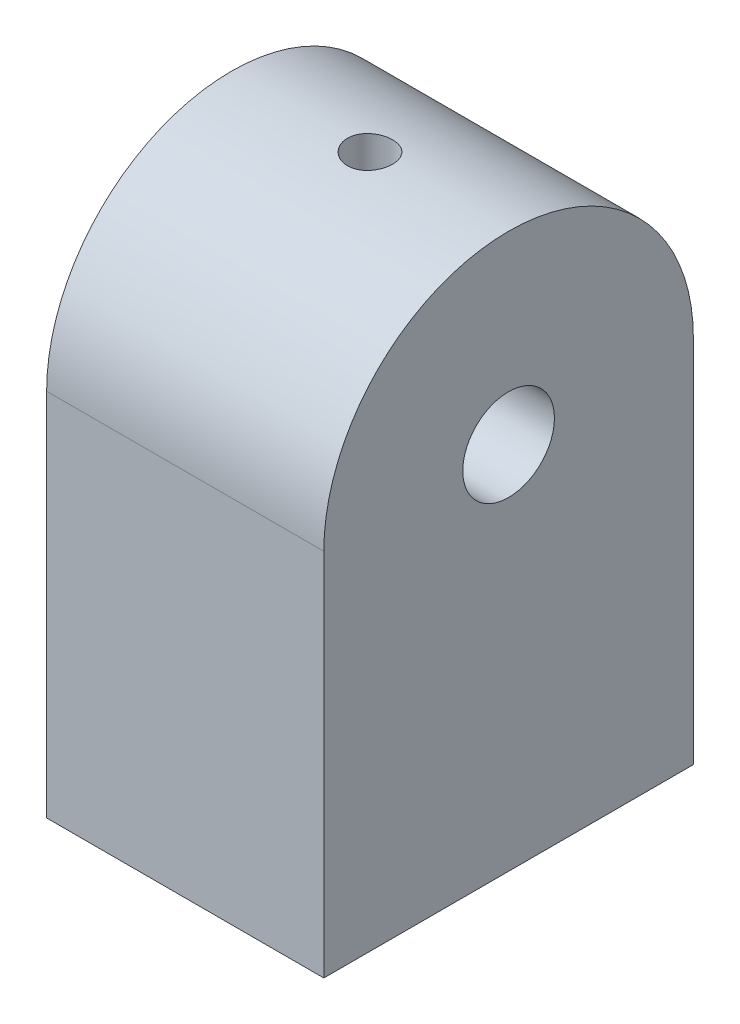
ISO-10303-21;
HEADER;
FILE_DESCRIPTION(('STEP AP214'),'2;1');
FILE_NAME('part.step','',(''),(''),'','','');
FILE_SCHEMA(('AUTOMOTIVE_DESIGN { 1 0 10303 214 1 1 1 1 }'));
ENDSEC;
DATA;
#1=APPLICATION_CONTEXT('core data for automotive mechanical design processes');
#2=APPLICATION_PROTOCOL_DEFINITION('international standard','automotive_design',2000,#1);
#3=PRODUCT_CONTEXT('',#1,'mechanical');
#4=PRODUCT('Part','Part','',(#3));
#5=PRODUCT_RELATED_PRODUCT_CATEGORY('part','',(#4));
#6=PRODUCT_DEFINITION_FORMATION('','',#4);
#7=PRODUCT_DEFINITION_CONTEXT('part definition',#1,'design');
#8=PRODUCT_DEFINITION('design','',#6,#7);
#9=PRODUCT_DEFINITION_SHAPE('','',#8);
#10=(LENGTH_UNIT() NAMED_UNIT(*) SI_UNIT(.MILLI.,.METRE.));
#11=(NAMED_UNIT(*) PLANE_ANGLE_UNIT() SI_UNIT($,.RADIAN.));
#12=(NAMED_UNIT(*) SI_UNIT($,.STERADIAN.) SOLID_ANGLE_UNIT());
#13=UNCERTAINTY_MEASURE_WITH_UNIT(LENGTH_MEASURE(1.E-05),#10,'distance_accuracy_value','');
#14=(GEOMETRIC_REPRESENTATION_CONTEXT(3) GLOBAL_UNCERTAINTY_ASSIGNED_CONTEXT((#13)) GLOBAL_UNIT_ASSIGNED_CONTEXT((#10,
#11,#12)) REPRESENTATION_CONTEXT('',''));
#15=CARTESIAN_POINT('',(0.,0.,0.));
#16=DIRECTION('',(0.,0.,1.));
#17=DIRECTION('',(1.,0.,0.));
#18=AXIS2_PLACEMENT_3D('',#15,#16,#17);
#19=CARTESIAN_POINT('',(19.05,0.,0.));
#20=DIRECTION('',(-1.,0.,0.));
#21=DIRECTION('',(0.,0.,1.));
#22=AXIS2_PLACEMENT_3D('',#19,#20,#21);
#23=CYLINDRICAL_SURFACE('',#22,12.7);
#24=CARTESIAN_POINT('',(9.525,12.6050585083926,1.55));
#25=CARTESIAN_POINT('',(9.43828439633688,12.6050597281026,1.54999630343117));
#26=CARTESIAN_POINT('',(9.35151418756669,12.6059629989048,1.54269842256029));
#27=CARTESIAN_POINT('',(9.18038741890009,12.6094772308036,1.51370045177698));
#28=CARTESIAN_POINT('',(9.09603349657854,12.6120899889592,1.49198520558837));
#29=CARTESIAN_POINT('',(8.93224178265716,12.6187229469086,1.43480118939925));
#30=CARTESIAN_POINT('',(8.85280074184576,12.6227422045205,1.39934162469759));
#31=CARTESIAN_POINT('',(8.70101205203439,12.6317341543352,1.3156949945592));
#32=CARTESIAN_POINT('',(8.62866316812048,12.6367066801039,1.26751015031463));
#33=CARTESIAN_POINT('',(8.4927109154581,12.6470746380593,1.15950493833858));
#34=CARTESIAN_POINT('',(8.42915090097718,12.6524719740522,1.09963017496472));
#35=CARTESIAN_POINT('',(8.31295497515077,12.6630642693682,0.97006176178273));
#36=CARTESIAN_POINT('',(8.26031960146911,12.6682592187203,0.90036762899075));
#37=CARTESIAN_POINT('',(8.16731219391353,12.6778808213328,0.75286710056468));
#38=CARTESIAN_POINT('',(8.12697930115505,12.6823050035928,0.67503584934896));
#39=CARTESIAN_POINT('',(8.05997241852068,12.6898656851265,0.513641796012167));
#40=CARTESIAN_POINT('',(8.03329794435266,12.6930022300556,0.430079197228975));
#41=CARTESIAN_POINT('',(7.99449436109489,12.6976208299471,0.260037345030383));
#42=CARTESIAN_POINT('',(7.9822932595898,12.699111071267,0.173574746204137));
#43=CARTESIAN_POINT('',(7.97255969723229,12.700297095441,-0.000182759228533415));
#44=CARTESIAN_POINT('',(7.97502668474856,12.6999929457777,-0.0874776344117916));
#45=CARTESIAN_POINT('',(7.9945014802059,12.6976310906728,-0.259932039986198));
#46=CARTESIAN_POINT('',(8.01143186396214,12.6955827224182,-0.345100459525125));
#47=CARTESIAN_POINT('',(8.05923188394579,12.6899731017917,-0.511378084856406));
#48=CARTESIAN_POINT('',(8.0901017746593,12.6864118217995,-0.592487216510488));
#49=CARTESIAN_POINT('',(8.16498719056126,12.6781604733776,-0.748584130758067));
#50=CARTESIAN_POINT('',(8.20903631918138,12.6734675255132,-0.823555634165232));
#51=CARTESIAN_POINT('',(8.30900537928631,12.6634780844907,-0.965071537540127));
#52=CARTESIAN_POINT('',(8.36492582985299,12.6581815649458,-1.03161556880753));
#53=CARTESIAN_POINT('',(8.48748403198491,12.6475372032355,-1.15484227392803));
#54=CARTESIAN_POINT('',(8.55418924368757,12.6421892515337,-1.21145786530756));
#55=CARTESIAN_POINT('',(8.69619143432719,12.6320788824911,-1.31269947842873));
#56=CARTESIAN_POINT('',(8.77148843797889,12.6273164668346,-1.35732546568039));
#57=CARTESIAN_POINT('',(8.9285955158682,12.6189163875327,-1.43332439934156));
#58=CARTESIAN_POINT('',(9.01040813768252,12.6152791665749,-1.46469213129991));
#59=CARTESIAN_POINT('',(9.17819376039931,12.6095500043591,-1.51322548174541));
#60=CARTESIAN_POINT('',(9.26416657027932,12.6074579922216,-1.5303917516643));
#61=CARTESIAN_POINT('',(9.43724010973637,12.6050689928309,-1.54994638075465));
#62=CARTESIAN_POINT('',(9.52433002898915,12.6047605474786,-1.55242907342255));
#63=CARTESIAN_POINT('',(9.69768456566861,12.6059433109282,-1.54279482465573));
#64=CARTESIAN_POINT('',(9.78394919980925,12.6074344832057,-1.53067817952529));
#65=CARTESIAN_POINT('',(9.95292273623674,12.6120380135831,-1.49226856448511));
#66=CARTESIAN_POINT('',(10.0356421441969,12.6151451628191,-1.46602113358276));
#67=CARTESIAN_POINT('',(10.1955055166998,12.6226263276656,-1.40014184210469));
#68=CARTESIAN_POINT('',(10.2726492939267,12.6270003858138,-1.36050953211152));
#69=CARTESIAN_POINT('',(10.4195987837699,12.6365500086172,-1.26875299589879));
#70=CARTESIAN_POINT('',(10.4893655574672,12.641729501337,-1.21656682385357));
#71=CARTESIAN_POINT('',(10.6191836289568,12.6522939974483,-1.10127166213115));
#72=CARTESIAN_POINT('',(10.6792345666537,12.6576790084478,-1.03816226778869));
#73=CARTESIAN_POINT('',(10.7882469338406,12.6680829075909,-0.902400385373916));
#74=CARTESIAN_POINT('',(10.8371464342391,12.6730996509913,-0.829697982482007));
#75=CARTESIAN_POINT('',(10.9220396458618,12.6821698056599,-0.677057068415659));
#76=CARTESIAN_POINT('',(10.9580336067785,12.6862232355655,-0.597118697277993));
#77=CARTESIAN_POINT('',(11.0159913907447,12.6929005122847,-0.432482131296456));
#78=CARTESIAN_POINT('',(11.0379912124686,12.6955280245634,-0.347796764034483));
#79=CARTESIAN_POINT('',(11.0674533832219,12.6990726156914,-0.175900021069135));
#80=CARTESIAN_POINT('',(11.0749163556655,12.6999897678898,-0.088688753851987));
#81=CARTESIAN_POINT('',(11.0750817083937,12.7000099956811,0.0851790339896079));
#82=CARTESIAN_POINT('',(11.0678796628476,12.6991248173403,0.171835477936462));
#83=CARTESIAN_POINT('',(11.0391215811767,12.6956631637845,0.342696731001358));
#84=CARTESIAN_POINT('',(11.0175655518492,12.6930866893704,0.426901541280365));
#85=CARTESIAN_POINT('',(10.9607409710377,12.6865307050751,0.590458232087275));
#86=CARTESIAN_POINT('',(10.9254767733179,12.682551640699,0.669811644185672));
#87=CARTESIAN_POINT('',(10.8422467806371,12.6736314576911,0.821489359733055));
#88=CARTESIAN_POINT('',(10.7942808633243,12.6686903297921,0.893813595462947));
#89=CARTESIAN_POINT('',(10.6866546594971,12.6583593898973,1.02986849301666));
#90=CARTESIAN_POINT('',(10.6269232249276,12.6529669690131,1.09354267811636));
#91=CARTESIAN_POINT('',(10.4976087522968,12.6423623020128,1.21000178107121));
#92=CARTESIAN_POINT('',(10.4280233807051,12.6371500989393,1.26278411230864));
#93=CARTESIAN_POINT('',(10.2806835175583,12.6274755372174,1.35612626176032));
#94=CARTESIAN_POINT('',(10.2028998713366,12.6230160121502,1.39664032924219));
#95=CARTESIAN_POINT('',(10.04162297796,12.6153849841421,1.46397414833981));
#96=CARTESIAN_POINT('',(9.95813608443011,12.6122120743494,1.49080886596847));
#97=CARTESIAN_POINT('',(9.81600966170555,12.6082878165417,1.52356290595442));
#98=CARTESIAN_POINT('',(9.7582683243704,12.6070828171679,1.53346265259569));
#99=CARTESIAN_POINT('',(9.64202627879842,12.6054677543156,1.54668242369402));
#100=CARTESIAN_POINT('',(9.58352557595597,12.6050576851932,1.5500024948661));
#101=CARTESIAN_POINT('',(9.525,12.6050585083926,1.55));
#102=B_SPLINE_CURVE_WITH_KNOTS('',3,(#24,#25,#26,#27,#28,#29,#30,#31,#32,#33,#34,#35,#36,#37,
#38,#39,#40,#41,#42,#43,#44,#45,#46,#47,#48,#49,#50,#51,#52,#53,#54,#55,#56,#57,#58,#59,#60,#61,
#62,#63,#64,#65,#66,#67,#68,#69,#70,#71,#72,#73,#74,#75,#76,#77,#78,#79,#80,#81,#82,#83,#84,#85,
#86,#87,#88,#89,#90,#91,#92,#93,#94,#95,#96,#97,#98,#99,#100,#101),.UNSPECIFIED.,.T.,.F.,(4,2,2,
2,2,2,2,2,2,2,2,2,2,2,2,2,2,2,2,2,2,2,2,2,2,2,2,2,2,2,2,2,2,2,2,2,2,2,4),(0.,0.259933017808429,
0.520139724162648,0.78017245658592,1.04015983037067,1.3013871238649,1.56262727079574,
1.82469010267902,2.08674364184991,2.3474881530168,2.60822285827605,2.86757050504712,
3.12692288678055,3.38694226432263,3.64697301373697,3.90869813624248,4.1704240116333,
4.43225272783604,4.69406943309285,4.95420227441904,5.21432983624715,5.47362406474086,
5.73292700029375,5.9935366787987,6.25415601400205,6.5161892351368,6.77821738625973,
7.03956873805277,7.3009088815241,7.56055128304974,7.82019356162039,8.07975344414267,
8.3393158270174,8.60049888201402,8.86174389204684,9.12395146624809,9.38587155092573,
9.56130523234605,9.73673766820053),.UNSPECIFIED.);
#103=CARTESIAN_POINT('',(9.525,12.6050585083926,1.55));
#104=VERTEX_POINT('',#103);
#105=EDGE_CURVE('E114',#104,#104,#102,.T.);
#106=ORIENTED_EDGE('',*,*,#105,.T.);
#107=EDGE_LOOP('',(#106));
#108=FACE_BOUND('',#107,.T.);
#109=DIRECTION('',(1.,0.,0.));
#110=VECTOR('',#109,1.);
#111=CARTESIAN_POINT('',(-35.9210244842766,0.,-12.7));
#112=LINE('',#111,#110);
#113=CARTESIAN_POINT('',(0.,0.,-12.7));
#114=VERTEX_POINT('',#113);
#115=CARTESIAN_POINT('',(19.05,0.,-12.7));
#116=VERTEX_POINT('',#115);
#117=EDGE_CURVE('E99',#114,#116,#112,.T.);
#118=ORIENTED_EDGE('',*,*,#117,.F.);
#119=CARTESIAN_POINT('',(0.,0.,0.));
#120=DIRECTION('',(1.,0.,0.));
#121=DIRECTION('',(0.,0.,-1.));
#122=AXIS2_PLACEMENT_3D('',#119,#120,#121);
#123=CIRCLE('',#122,12.7);
#124=CARTESIAN_POINT('',(0.,0.,12.7));
#125=VERTEX_POINT('',#124);
#126=EDGE_CURVE('E51',#114,#125,#123,.T.);
#127=ORIENTED_EDGE('',*,*,#126,.T.);
#128=DIRECTION('',(1.,0.,0.));
#129=VECTOR('',#128,1.);
#130=CARTESIAN_POINT('',(-35.9210244842766,0.,12.7));
#131=LINE('',#130,#129);
#132=CARTESIAN_POINT('',(19.05,0.,12.7));
#133=VERTEX_POINT('',#132);
#134=EDGE_CURVE('E126',#125,#133,#131,.T.);
#135=ORIENTED_EDGE('',*,*,#134,.T.);
#136=CARTESIAN_POINT('',(19.05,0.,0.));
#137=DIRECTION('',(1.,0.,0.));
#138=DIRECTION('',(0.,0.,-1.));
#139=AXIS2_PLACEMENT_3D('',#136,#137,#138);
#140=CIRCLE('',#139,12.7);
#141=EDGE_CURVE('E11',#116,#133,#140,.T.);
#142=ORIENTED_EDGE('',*,*,#141,.F.);
#143=EDGE_LOOP('',(#118,#127,#135,#142));
#144=FACE_BOUND('',#143,.T.);
#145=ADVANCED_FACE('F50',(#108,#144),#23,.T.);
#146=CARTESIAN_POINT('',(19.05,0.,0.));
#147=DIRECTION('',(1.,0.,0.));
#148=DIRECTION('',(0.,0.,-1.));
#149=AXIS2_PLACEMENT_3D('',#146,#147,#148);
#150=PLANE('',#149);
#151=ORIENTED_EDGE('',*,*,#141,.T.);
#152=DIRECTION('',(0.,-1.,0.));
#153=VECTOR('',#152,1.);
#154=CARTESIAN_POINT('',(19.05,0.,12.7));
#155=LINE('',#154,#153);
#156=CARTESIAN_POINT('',(19.05,-25.4,12.7));
#157=VERTEX_POINT('',#156);
#158=EDGE_CURVE('E64',#133,#157,#155,.T.);
#159=ORIENTED_EDGE('',*,*,#158,.T.);
#160=DIRECTION('',(0.,0.,1.));
#161=VECTOR('',#160,1.);
#162=CARTESIAN_POINT('',(19.05,-25.4,0.));
#163=LINE('',#162,#161);
#164=CARTESIAN_POINT('',(19.05,-25.4,-12.7));
#165=VERTEX_POINT('',#164);
#166=EDGE_CURVE('E96',#165,#157,#163,.T.);
#167=ORIENTED_EDGE('',*,*,#166,.F.);
#168=DIRECTION('',(0.,-1.,0.));
#169=VECTOR('',#168,1.);
#170=CARTESIAN_POINT('',(19.05,0.,-12.7));
#171=LINE('',#170,#169);
#172=EDGE_CURVE('E103',#116,#165,#171,.T.);
#173=ORIENTED_EDGE('',*,*,#172,.F.);
#174=EDGE_LOOP('',(#151,#159,#167,#173));
#175=FACE_BOUND('',#174,.T.);
#176=CARTESIAN_POINT('',(19.05,0.,0.));
#177=DIRECTION('',(1.,0.,0.));
#178=DIRECTION('',(0.,0.,-1.));
#179=AXIS2_PLACEMENT_3D('',#176,#177,#178);
#180=CIRCLE('',#179,3.15);
#181=CARTESIAN_POINT('',(19.05,0.,-3.15));
#182=VERTEX_POINT('',#181);
#183=EDGE_CURVE('E133',#182,#182,#180,.T.);
#184=ORIENTED_EDGE('',*,*,#183,.F.);
#185=EDGE_LOOP('',(#184));
#186=FACE_BOUND('',#185,.T.);
#187=ADVANCED_FACE('F109',(#175,#186),#150,.T.);
#188=CARTESIAN_POINT('',(0.,0.,0.));
#189=DIRECTION('',(1.,0.,0.));
#190=DIRECTION('',(0.,0.,-1.));
#191=AXIS2_PLACEMENT_3D('',#188,#189,#190);
#192=PLANE('',#191);
#193=ORIENTED_EDGE('',*,*,#126,.F.);
#194=DIRECTION('',(0.,1.,0.));
#195=VECTOR('',#194,1.);
#196=CARTESIAN_POINT('',(0.,0.,-12.7));
#197=LINE('',#196,#195);
#198=CARTESIAN_POINT('',(0.,-25.4,-12.7));
#199=VERTEX_POINT('',#198);
#200=EDGE_CURVE('E130',#199,#114,#197,.T.);
#201=ORIENTED_EDGE('',*,*,#200,.F.);
#202=DIRECTION('',(0.,0.,-1.));
#203=VECTOR('',#202,1.);
#204=CARTESIAN_POINT('',(0.,-25.4,0.));
#205=LINE('',#204,#203);
#206=CARTESIAN_POINT('',(0.,-25.4,12.7));
#207=VERTEX_POINT('',#206);
#208=EDGE_CURVE('E100',#207,#199,#205,.T.);
#209=ORIENTED_EDGE('',*,*,#208,.F.);
#210=DIRECTION('',(0.,1.,0.));
#211=VECTOR('',#210,1.);
#212=CARTESIAN_POINT('',(0.,0.,12.7));
#213=LINE('',#212,#211);
#214=EDGE_CURVE('E72',#207,#125,#213,.T.);
#215=ORIENTED_EDGE('',*,*,#214,.T.);
#216=EDGE_LOOP('',(#193,#201,#209,#215));
#217=FACE_BOUND('',#216,.T.);
#218=CARTESIAN_POINT('',(0.,0.,0.));
#219=DIRECTION('',(1.,0.,0.));
#220=DIRECTION('',(0.,0.,-1.));
#221=AXIS2_PLACEMENT_3D('',#218,#219,#220);
#222=CIRCLE('',#221,3.15);
#223=CARTESIAN_POINT('',(0.,0.,-3.15));
#224=VERTEX_POINT('',#223);
#225=EDGE_CURVE('E140',#224,#224,#222,.T.);
#226=ORIENTED_EDGE('',*,*,#225,.T.);
#227=EDGE_LOOP('',(#226));
#228=FACE_BOUND('',#227,.T.);
#229=ADVANCED_FACE('F175',(#217,#228),#192,.F.);
#230=CARTESIAN_POINT('',(19.05,0.,0.));
#231=DIRECTION('',(-1.,0.,0.));
#232=DIRECTION('',(0.,0.,1.));
#233=AXIS2_PLACEMENT_3D('',#230,#231,#232);
#234=CYLINDRICAL_SURFACE('',#233,3.15);
#235=CARTESIAN_POINT('',(9.525,2.74226184016043,1.55));
#236=CARTESIAN_POINT('',(9.60596467100865,2.74226853161027,1.54999454252612));
#237=CARTESIAN_POINT('',(9.68703603920623,2.74590169984353,1.5436141026406));
#238=CARTESIAN_POINT('',(9.84670638008794,2.75991400380195,1.51841029000853));
#239=CARTESIAN_POINT('',(9.92529960542148,2.7703077623488,1.49955994396489));
#240=CARTESIAN_POINT('',(10.0774045848562,2.79634699748634,1.45041546031029));
#241=CARTESIAN_POINT('',(10.1509403856872,2.81196520016854,1.42018065370526));
#242=CARTESIAN_POINT('',(10.2918776690342,2.84665142861159,1.34930627844133));
#243=CARTESIAN_POINT('',(10.3592789882417,2.8657195461736,1.3086664328956));
#244=CARTESIAN_POINT('',(10.4919733968432,2.90701691015784,1.21433349679573));
#245=CARTESIAN_POINT('',(10.5566697725973,2.92937698130797,1.15985793009901));
#246=CARTESIAN_POINT('',(10.6764696959946,2.97368137324273,1.04102872395814));
#247=CARTESIAN_POINT('',(10.731568585358,2.99562548755735,0.976670316088991));
#248=CARTESIAN_POINT('',(10.8340996837888,3.03832661449205,0.834804917682589));
#249=CARTESIAN_POINT('',(10.8808040356541,3.05891464204131,0.756716241944807));
#250=CARTESIAN_POINT('',(10.9601418008951,3.09489545160931,0.592587784034193));
#251=CARTESIAN_POINT('',(10.9927838204053,3.11029140991289,0.506552904198919));
#252=CARTESIAN_POINT('',(11.0407274753795,3.13321219230641,0.335290967203968));
#253=CARTESIAN_POINT('',(11.0570737407943,3.141208414693,0.250420853164812));
#254=CARTESIAN_POINT('',(11.075395604209,3.15018390089209,0.078794501348735));
#255=CARTESIAN_POINT('',(11.0773795852967,3.15116725802237,-0.00796060651306746));
#256=CARTESIAN_POINT('',(11.0673385409833,3.14623530547222,-0.173067172681921));
#257=CARTESIAN_POINT('',(11.0564801861917,3.14089447188491,-0.251510620562551));
#258=CARTESIAN_POINT('',(11.023141546108,3.12477451404673,-0.405293885697731));
#259=CARTESIAN_POINT('',(11.0006603932579,3.11399498383786,-0.48063347081803));
#260=CARTESIAN_POINT('',(10.944551061813,3.08779905524476,-0.627406223549384));
#261=CARTESIAN_POINT('',(10.9107695568305,3.07231916341901,-0.698768974819523));
#262=CARTESIAN_POINT('',(10.8332213741307,3.03812984931855,-0.834988785806039));
#263=CARTESIAN_POINT('',(10.7894510879935,3.0194192605593,-0.899843482285953));
#264=CARTESIAN_POINT('',(10.6885206659912,2.97849955817562,-1.02759127567156));
#265=CARTESIAN_POINT('',(10.6304975278672,2.95612693154655,-1.0897507723912));
#266=CARTESIAN_POINT('',(10.5050277334256,2.91153151325015,-1.2038456161431));
#267=CARTESIAN_POINT('',(10.4375742826745,2.88930884183386,-1.25577352585594));
#268=CARTESIAN_POINT('',(10.2901877078242,2.84609605508265,-1.35097546711201));
#269=CARTESIAN_POINT('',(10.2097484699999,2.82526004222575,-1.39354276248092));
#270=CARTESIAN_POINT('',(10.0415802305348,2.78929163858304,-1.46422024228985));
#271=CARTESIAN_POINT('',(9.95385873964617,2.77415345823306,-1.49234511231673));
#272=CARTESIAN_POINT('',(9.78086433471198,2.75294298823936,-1.53109779143941));
#273=CARTESIAN_POINT('',(9.6959383862033,2.74625312936443,-1.54292420779395));
#274=CARTESIAN_POINT('',(9.52507148461431,2.74093598258672,-1.55235536588458));
#275=CARTESIAN_POINT('',(9.43913123527359,2.74230339886562,-1.54996944897274));
#276=CARTESIAN_POINT('',(9.27822102889997,2.75229240392449,-1.53214375174879));
#277=CARTESIAN_POINT('',(9.20304177866589,2.76014249826299,-1.51809146042544));
#278=CARTESIAN_POINT('',(9.0562422077744,2.78108767333983,-1.47936882916622));
#279=CARTESIAN_POINT('',(8.98462300318521,2.7941843873722,-1.45469518258082));
#280=CARTESIAN_POINT('',(8.84320262533347,2.82486352646758,-1.39421729764573));
#281=CARTESIAN_POINT('',(8.77364020912818,2.84262597182159,-1.35794950493587));
#282=CARTESIAN_POINT('',(8.64119092686429,2.88046560585603,-1.27572146776745));
#283=CARTESIAN_POINT('',(8.57830749659255,2.90054397491634,-1.22975627075348));
#284=CARTESIAN_POINT('',(8.45302433964467,2.94368182088031,-1.12291601681771));
#285=CARTESIAN_POINT('',(8.39160854134129,2.96680747832741,-1.06090870967945));
#286=CARTESIAN_POINT('',(8.27975842175652,3.01131054711028,-0.927081450269787));
#287=CARTESIAN_POINT('',(8.22932744479326,3.03268742479834,-0.855258520442272));
#288=CARTESIAN_POINT('',(8.1399105202789,3.07194066567362,-0.701506968238277));
#289=CARTESIAN_POINT('',(8.10121869504572,3.08972383724356,-0.619381838600105));
#290=CARTESIAN_POINT('',(8.03857829672564,3.11908293725502,-0.448662392595782));
#291=CARTESIAN_POINT('',(8.0146171828536,3.13066414456605,-0.36007365102335));
#292=CARTESIAN_POINT('',(7.98412265024668,3.14549601679594,-0.187538020525367));
#293=CARTESIAN_POINT('',(7.97621651444528,3.1494018176534,-0.103889478390557));
#294=CARTESIAN_POINT('',(7.97404510345999,3.15046945397008,0.06361582922141));
#295=CARTESIAN_POINT('',(7.97977535439089,3.14763350129351,0.147472517391773));
#296=CARTESIAN_POINT('',(8.00378965626687,3.13591823325555,0.307502922919025));
#297=CARTESIAN_POINT('',(8.0212664702364,3.12742782204127,0.383829209968325));
#298=CARTESIAN_POINT('',(8.06721153524622,3.10559813045551,0.53235170935709));
#299=CARTESIAN_POINT('',(8.09568141102278,3.09225813334917,0.604547309383564));
#300=CARTESIAN_POINT('',(8.16411076743002,3.06121714981888,0.746286439453723));
#301=CARTESIAN_POINT('',(8.20451708436377,3.04335137964392,0.815577088735318));
#302=CARTESIAN_POINT('',(8.2951054472659,3.00515465353096,0.946687015981495));
#303=CARTESIAN_POINT('',(8.34529199494252,2.98482256401277,1.00850283206736));
#304=CARTESIAN_POINT('',(8.45965266944592,2.94141143813516,1.12920279176856));
#305=CARTESIAN_POINT('',(8.52471015739145,2.91825690930049,1.18722523204422));
#306=CARTESIAN_POINT('',(8.66402858515526,2.87348665200984,1.29182832394465));
#307=CARTESIAN_POINT('',(8.73829715726294,2.85187222334156,1.33839939039794));
#308=CARTESIAN_POINT('',(8.89663118948733,2.81226265871655,1.41978439669059));
#309=CARTESIAN_POINT('',(8.98090631052328,2.79438041182741,1.45424869958025));
#310=CARTESIAN_POINT('',(9.15517150733789,2.76576825892026,1.50797117402954));
#311=CARTESIAN_POINT('',(9.24514132441642,2.75501440537743,1.52728029940288));
#312=CARTESIAN_POINT('',(9.36752958819606,2.74659929591585,1.54230446036018));
#313=CARTESIAN_POINT('',(9.39892622333789,2.74497805381289,1.54518611623872));
#314=CARTESIAN_POINT('',(9.4618764916519,2.74280798694638,1.5490350114941));
#315=CARTESIAN_POINT('',(9.49343013477131,2.74225923102033,1.55000212798635));
#316=CARTESIAN_POINT('',(9.525,2.74226184016043,1.55));
#317=B_SPLINE_CURVE_WITH_KNOTS('',3,(#235,#236,#237,#238,#239,#240,#241,#242,#243,#244,#245,
#246,#247,#248,#249,#250,#251,#252,#253,#254,#255,#256,#257,#258,#259,#260,#261,#262,#263,#264,
#265,#266,#267,#268,#269,#270,#271,#272,#273,#274,#275,#276,#277,#278,#279,#280,#281,#282,#283,
#284,#285,#286,#287,#288,#289,#290,#291,#292,#293,#294,#295,#296,#297,#298,#299,#300,#301,#302,
#303,#304,#305,#306,#307,#308,#309,#310,#311,#312,#313,#314,#315,#316),.UNSPECIFIED.,.T.,.F.,(4,
2,2,2,2,2,2,2,2,2,2,2,2,2,2,2,2,2,2,2,2,2,2,2,2,2,2,2,2,2,2,2,2,2,2,2,2,2,2,2,4),(0.,
0.242761247591439,0.486049329670165,0.728086662260625,0.970130436337226,1.23147542647236,
1.4929469128762,1.77135634567628,2.04959514926867,2.30855842283341,2.56737053053941,
2.80436836407095,3.04138389033445,3.28175537830554,3.5222138376637,3.7848671059963,
4.04771059774947,4.32633463931784,4.6046748019392,4.86119928708607,5.11755518478401,
5.34717286227375,5.57686207629479,5.81721448917122,6.05768995072061,6.32733520534955,
6.59706243882402,6.8730757765805,7.14885380765926,7.39984735513697,7.6507585669111,
7.88598327716111,8.12124276611983,8.36675982023762,8.6123901506037,8.88177586604065,
9.15138630430583,9.42824304286021,9.70416491490992,9.79881666747966,9.89347449506954),.UNSPECIFIED.);
#318=CARTESIAN_POINT('',(9.525,2.74226184016043,1.55));
#319=VERTEX_POINT('',#318);
#320=EDGE_CURVE('E120',#319,#319,#317,.T.);
#321=ORIENTED_EDGE('',*,*,#320,.T.);
#322=EDGE_LOOP('',(#321));
#323=FACE_BOUND('',#322,.T.);
#324=ORIENTED_EDGE('',*,*,#183,.T.);
#325=EDGE_LOOP('',(#324));
#326=FACE_BOUND('',#325,.T.);
#327=ORIENTED_EDGE('',*,*,#225,.F.);
#328=EDGE_LOOP('',(#327));
#329=FACE_BOUND('',#328,.T.);
#330=ADVANCED_FACE('F170',(#323,#326,#329),#234,.F.);
#331=CARTESIAN_POINT('',(-35.9210244842766,0.,-12.7));
#332=DIRECTION('',(0.,0.,1.));
#333=DIRECTION('',(1.,0.,0.));
#334=AXIS2_PLACEMENT_3D('',#331,#332,#333);
#335=PLANE('',#334);
#336=DIRECTION('',(1.,0.,0.));
#337=VECTOR('',#336,1.);
#338=CARTESIAN_POINT('',(-35.9210244842766,-25.4,-12.7));
#339=LINE('',#338,#337);
#340=EDGE_CURVE('E93',#199,#165,#339,.T.);
#341=ORIENTED_EDGE('',*,*,#340,.F.);
#342=ORIENTED_EDGE('',*,*,#200,.T.);
#343=ORIENTED_EDGE('',*,*,#117,.T.);
#344=ORIENTED_EDGE('',*,*,#172,.T.);
#345=EDGE_LOOP('',(#341,#342,#343,#344));
#346=FACE_BOUND('',#345,.T.);
#347=ADVANCED_FACE('F102',(#346),#335,.F.);
#348=CARTESIAN_POINT('',(-35.9210244842766,0.,12.7));
#349=DIRECTION('',(0.,0.,1.));
#350=DIRECTION('',(0.,-1.,0.));
#351=AXIS2_PLACEMENT_3D('',#348,#349,#350);
#352=PLANE('',#351);
#353=ORIENTED_EDGE('',*,*,#214,.F.);
#354=DIRECTION('',(1.,0.,0.));
#355=VECTOR('',#354,1.);
#356=CARTESIAN_POINT('',(-35.9210244842766,-25.4,12.7));
#357=LINE('',#356,#355);
#358=EDGE_CURVE('E125',#207,#157,#357,.T.);
#359=ORIENTED_EDGE('',*,*,#358,.T.);
#360=ORIENTED_EDGE('',*,*,#158,.F.);
#361=ORIENTED_EDGE('',*,*,#134,.F.);
#362=EDGE_LOOP('',(#353,#359,#360,#361));
#363=FACE_BOUND('',#362,.T.);
#364=ADVANCED_FACE('F161',(#363),#352,.T.);
#365=CARTESIAN_POINT('',(-35.9210244842766,-25.4,0.));
#366=DIRECTION('',(0.,1.,0.));
#367=DIRECTION('',(0.,0.,1.));
#368=AXIS2_PLACEMENT_3D('',#365,#366,#367);
#369=PLANE('',#368);
#370=ORIENTED_EDGE('',*,*,#358,.F.);
#371=ORIENTED_EDGE('',*,*,#208,.T.);
#372=ORIENTED_EDGE('',*,*,#340,.T.);
#373=ORIENTED_EDGE('',*,*,#166,.T.);
#374=EDGE_LOOP('',(#370,#371,#372,#373));
#375=FACE_BOUND('',#374,.T.);
#376=ADVANCED_FACE('F94',(#375),#369,.F.);
#377=CARTESIAN_POINT('',(9.525,-25.401,0.));
#378=DIRECTION('',(0.,1.,0.));
#379=DIRECTION('',(0.,0.,1.));
#380=AXIS2_PLACEMENT_3D('',#377,#378,#379);
#381=CYLINDRICAL_SURFACE('',#380,1.55);
#382=ORIENTED_EDGE('',*,*,#320,.F.);
#383=EDGE_LOOP('',(#382));
#384=FACE_BOUND('',#383,.T.);
#385=ORIENTED_EDGE('',*,*,#105,.F.);
#386=EDGE_LOOP('',(#385));
#387=FACE_BOUND('',#386,.T.);
#388=ADVANCED_FACE('F154',(#384,#387),#381,.F.);
#389=CLOSED_SHELL('',(#145,#187,#229,#330,#347,#364,#376,#388));
#390=MANIFOLD_SOLID_BREP('B2',#389);
#391=ADVANCED_BREP_SHAPE_REPRESENTATION('',(#18,#390),#14);
#392=SHAPE_DEFINITION_REPRESENTATION(#9,#391);
ENDSEC;
END-ISO-10303-21;
